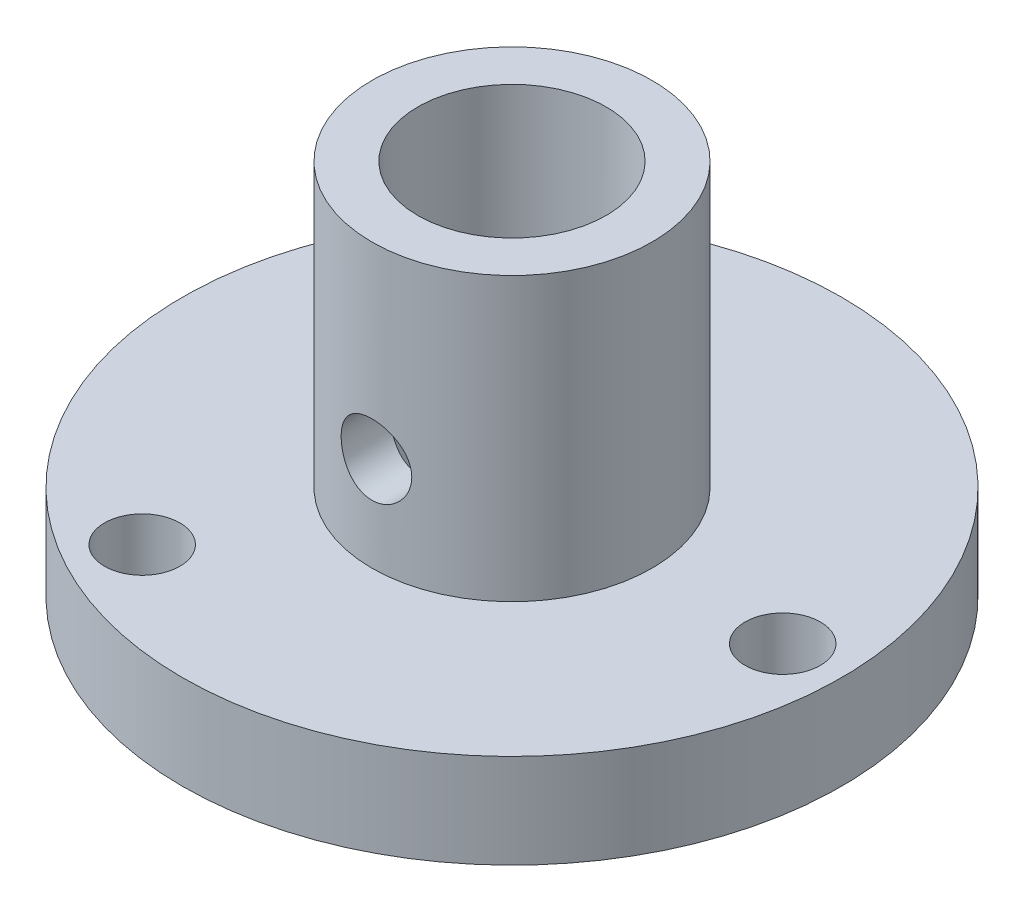
ISO-10303-21;
HEADER;
FILE_DESCRIPTION(('STEP AP214'),'2;1');
FILE_NAME('part.step','',(''),(''),'','','');
FILE_SCHEMA(('AUTOMOTIVE_DESIGN { 1 0 10303 214 1 1 1 1 }'));
ENDSEC;
DATA;
#1=APPLICATION_CONTEXT('core data for automotive mechanical design processes');
#2=APPLICATION_PROTOCOL_DEFINITION('international standard','automotive_design',2000,#1);
#3=PRODUCT_CONTEXT('',#1,'mechanical');
#4=PRODUCT('Part','Part','',(#3));
#5=PRODUCT_RELATED_PRODUCT_CATEGORY('part','',(#4));
#6=PRODUCT_DEFINITION_FORMATION('','',#4);
#7=PRODUCT_DEFINITION_CONTEXT('part definition',#1,'design');
#8=PRODUCT_DEFINITION('design','',#6,#7);
#9=PRODUCT_DEFINITION_SHAPE('','',#8);
#10=(LENGTH_UNIT() NAMED_UNIT(*) SI_UNIT(.MILLI.,.METRE.));
#11=(NAMED_UNIT(*) PLANE_ANGLE_UNIT() SI_UNIT($,.RADIAN.));
#12=(NAMED_UNIT(*) SI_UNIT($,.STERADIAN.) SOLID_ANGLE_UNIT());
#13=UNCERTAINTY_MEASURE_WITH_UNIT(LENGTH_MEASURE(1.E-05),#10,'distance_accuracy_value','');
#14=(GEOMETRIC_REPRESENTATION_CONTEXT(3) GLOBAL_UNCERTAINTY_ASSIGNED_CONTEXT((#13)) GLOBAL_UNIT_ASSIGNED_CONTEXT((#10,
#11,#12)) REPRESENTATION_CONTEXT('',''));
#15=CARTESIAN_POINT('',(0.,0.,0.));
#16=DIRECTION('',(0.,0.,1.));
#17=DIRECTION('',(1.,0.,0.));
#18=AXIS2_PLACEMENT_3D('',#15,#16,#17);
#19=CARTESIAN_POINT('',(0.,4.,0.));
#20=DIRECTION('',(0.,1.,0.));
#21=DIRECTION('',(0.,0.,1.));
#22=AXIS2_PLACEMENT_3D('',#19,#20,#21);
#23=CYLINDRICAL_SURFACE('',#22,5.95);
#24=CARTESIAN_POINT('',(0.,4.,0.));
#25=DIRECTION('',(0.,1.,0.));
#26=DIRECTION('',(0.,0.,1.));
#27=AXIS2_PLACEMENT_3D('',#24,#25,#26);
#28=CIRCLE('',#27,5.95);
#29=CARTESIAN_POINT('',(0.,4.,5.95));
#30=VERTEX_POINT('',#29);
#31=EDGE_CURVE('E115',#30,#30,#28,.F.);
#32=ORIENTED_EDGE('',*,*,#31,.F.);
#33=EDGE_LOOP('',(#32));
#34=FACE_BOUND('',#33,.T.);
#35=CARTESIAN_POINT('',(1.5,8.,-5.75782076831157));
#36=CARTESIAN_POINT('',(1.49999768871238,8.08280616495256,-5.75782233494609));
#37=CARTESIAN_POINT('',(1.49311978240876,8.16563776411494,-5.75962659429058));
#38=CARTESIAN_POINT('',(1.4658347600793,8.32892064843115,-5.7666298668346));
#39=CARTESIAN_POINT('',(1.44541990472251,8.40937054441823,-5.77183082196396));
#40=CARTESIAN_POINT('',(1.39176505830194,8.56550457418769,-5.7850018540609));
#41=CARTESIAN_POINT('',(1.35854180384155,8.64119477791168,-5.79296831602232));
#42=CARTESIAN_POINT('',(1.28026440234075,8.7859358420616,-5.81076822901485));
#43=CARTESIAN_POINT('',(1.23520970107067,8.85498639125396,-5.82060176750092));
#44=CARTESIAN_POINT('',(1.13347144633303,8.98603298568028,-5.8412741714264));
#45=CARTESIAN_POINT('',(1.07657158002437,9.04785856109596,-5.852129319229));
#46=CARTESIAN_POINT('',(0.953224007108164,9.16119777014973,-5.87348068088484));
#47=CARTESIAN_POINT('',(0.886775397339863,9.21271042724392,-5.88397686066896));
#48=CARTESIAN_POINT('',(0.745046980007374,9.30466064010565,-5.90360798591029));
#49=CARTESIAN_POINT('',(0.66965513530347,9.34493048314347,-5.91272147754516));
#50=CARTESIAN_POINT('',(0.512904027550645,9.41216106905905,-5.92837449499029));
#51=CARTESIAN_POINT('',(0.431545662394266,9.43912380980091,-5.93491440715546));
#52=CARTESIAN_POINT('',(0.266948406817762,9.47842809793499,-5.944568286417));
#53=CARTESIAN_POINT('',(0.183782699911668,9.49105919198469,-5.94775000410434));
#54=CARTESIAN_POINT('',(0.0164559237692994,9.50225076427592,-5.95056519154128));
#55=CARTESIAN_POINT('',(-0.0677049940231949,9.50081335652321,-5.95019919438891));
#56=CARTESIAN_POINT('',(-0.232624117632466,9.48411644185821,-5.94601052596882));
#57=CARTESIAN_POINT('',(-0.313416254189624,9.46916950854622,-5.94226602741368));
#58=CARTESIAN_POINT('',(-0.471306468441187,9.42638056850823,-5.93183226465853));
#59=CARTESIAN_POINT('',(-0.548404347404612,9.39853786891751,-5.92514284223439));
#60=CARTESIAN_POINT('',(-0.697537874248503,9.33049649456481,-5.90945172411485));
#61=CARTESIAN_POINT('',(-0.769520747132065,9.29018709230811,-5.90042943091868));
#62=CARTESIAN_POINT('',(-0.905809634403644,9.19844066483173,-5.88105044710892));
#63=CARTESIAN_POINT('',(-0.97011428998757,9.1470016745393,-5.87069352097939));
#64=CARTESIAN_POINT('',(-1.09108572538244,9.03278261151473,-5.84943692140127));
#65=CARTESIAN_POINT('',(-1.14749370224276,8.96972946000243,-5.83853015514328));
#66=CARTESIAN_POINT('',(-1.24899361099793,8.83494462622132,-5.81766341566799));
#67=CARTESIAN_POINT('',(-1.29408499549124,8.76321252438654,-5.80770348826526));
#68=CARTESIAN_POINT('',(-1.37184123304776,8.61259178695898,-5.78983234742103));
#69=CARTESIAN_POINT('',(-1.40444280016486,8.53366914899718,-5.78193163088578));
#70=CARTESIAN_POINT('',(-1.45583400038077,8.37121571984059,-5.76920756152378));
#71=CARTESIAN_POINT('',(-1.47462664585967,8.28768593795908,-5.76438353755494));
#72=CARTESIAN_POINT('',(-1.49743510422221,8.12079191991817,-5.75850017235609));
#73=CARTESIAN_POINT('',(-1.50183399029071,8.03748341446134,-5.75734326195708));
#74=CARTESIAN_POINT('',(-1.49677962599947,7.87132239473432,-5.75865936105513));
#75=CARTESIAN_POINT('',(-1.48732767478012,7.78846983842995,-5.76113203011554));
#76=CARTESIAN_POINT('',(-1.45517605430573,7.62700159452032,-5.76933509320014));
#77=CARTESIAN_POINT('',(-1.43270030307497,7.5483382530739,-5.77501038251313));
#78=CARTESIAN_POINT('',(-1.37538778324766,7.39589600588675,-5.78892671981359));
#79=CARTESIAN_POINT('',(-1.34054953143309,7.32211768749821,-5.79716807565594));
#80=CARTESIAN_POINT('',(-1.25870211192783,7.1799191873588,-5.81549274421369));
#81=CARTESIAN_POINT('',(-1.21146441620507,7.11163494417298,-5.82560946549267));
#82=CARTESIAN_POINT('',(-1.10644727101093,6.98382169560074,-5.84646341851986));
#83=CARTESIAN_POINT('',(-1.04866605859182,6.92429415740595,-5.8572007538335));
#84=CARTESIAN_POINT('',(-0.922442319036814,6.81412760660396,-5.87841742128496));
#85=CARTESIAN_POINT('',(-0.853765566559675,6.76375385725042,-5.88888319927538));
#86=CARTESIAN_POINT('',(-0.708705846793871,6.67525354560696,-5.90809451049535));
#87=CARTESIAN_POINT('',(-0.632323283420052,6.63712634182873,-5.91684013381929));
#88=CARTESIAN_POINT('',(-0.474550020021314,6.57453510167375,-5.93157038923435));
#89=CARTESIAN_POINT('',(-0.393200480838869,6.54997222088231,-5.93757493855685));
#90=CARTESIAN_POINT('',(-0.227356564063108,6.51491126434763,-5.94623375048927));
#91=CARTESIAN_POINT('',(-0.142862807686707,6.50441042530947,-5.94888867131996));
#92=CARTESIAN_POINT('',(0.0243807825053443,6.49792926093417,-5.95052170309761));
#93=CARTESIAN_POINT('',(0.107114717761271,6.50155776439544,-5.94959886746453));
#94=CARTESIAN_POINT('',(0.270753753592761,6.52233480837991,-5.94440026733245));
#95=CARTESIAN_POINT('',(0.35165891016747,6.53948293433942,-5.94012460564403));
#96=CARTESIAN_POINT('',(0.508926820324036,6.58660120238174,-5.92871663200681));
#97=CARTESIAN_POINT('',(0.58531232285441,6.61649954445729,-5.9216003306315));
#98=CARTESIAN_POINT('',(0.732025921925321,6.68820456280268,-5.90525977473839));
#99=CARTESIAN_POINT('',(0.802353242177573,6.73001276224005,-5.89603525062704));
#100=CARTESIAN_POINT('',(0.936804832205172,6.82553778839852,-5.87619190076882));
#101=CARTESIAN_POINT('',(1.00073686496424,6.8795192820921,-5.86554464290918));
#102=CARTESIAN_POINT('',(1.11876772120989,6.99734616967057,-5.84418209657475));
#103=CARTESIAN_POINT('',(1.17286403694311,7.06119407147921,-5.83346679146906));
#104=CARTESIAN_POINT('',(1.27070101081858,7.19840586566362,-5.81294857955095));
#105=CARTESIAN_POINT('',(1.31422468836178,7.27192790909911,-5.80316695036892));
#106=CARTESIAN_POINT('',(1.38822949660823,7.42548182868025,-5.78591158942593));
#107=CARTESIAN_POINT('',(1.41872000118598,7.50550897667455,-5.77843620002403));
#108=CARTESIAN_POINT('',(1.46132037834492,7.65448098960835,-5.76779217545035));
#109=CARTESIAN_POINT('',(1.47579332540437,7.72272085703775,-5.76408129197266));
#110=CARTESIAN_POINT('',(1.4951336837741,7.86063456266476,-5.7590950369232));
#111=CARTESIAN_POINT('',(1.50000194523711,7.93030827339497,-5.75781944979301));
#112=CARTESIAN_POINT('',(1.5,8.,-5.75782076831157));
#113=B_SPLINE_CURVE_WITH_KNOTS('',3,(#35,#36,#37,#38,#39,#40,#41,#42,#43,#44,#45,#46,#47,#48,
#49,#50,#51,#52,#53,#54,#55,#56,#57,#58,#59,#60,#61,#62,#63,#64,#65,#66,#67,#68,#69,#70,#71,#72,
#73,#74,#75,#76,#77,#78,#79,#80,#81,#82,#83,#84,#85,#86,#87,#88,#89,#90,#91,#92,#93,#94,#95,#96,
#97,#98,#99,#100,#101,#102,#103,#104,#105,#106,#107,#108,#109,#110,#111,#112),.UNSPECIFIED.,.T.,
.F.,(4,2,2,2,2,2,2,2,2,2,2,2,2,2,2,2,2,2,2,2,2,2,2,2,2,2,2,2,2,2,2,2,2,2,2,2,2,2,4),(0.,
0.24816252440501,0.496467050509526,0.744448213372956,0.992440994683889,1.24543802607959,
1.49845900277979,1.75507407358384,2.01165060571106,2.26294561163234,2.51420285724788,
2.75979145951352,3.00539325831315,3.25324234223002,3.50113522287185,3.75584806293773,
4.01057322149467,4.26657252022556,4.5225159567871,4.77158985386633,5.02064039053487,
5.26553095551585,5.51045091171653,5.76024757088363,6.01008603608886,6.26629324643614,
6.52248703416231,6.77678841394288,7.03103981429034,7.27830297848152,7.52555856092682,
7.77143979209798,8.01735248347586,8.2692402221725,8.52119209338009,8.77794514182155,
9.03451321327094,9.24339145154696,9.45225120026682),.UNSPECIFIED.);
#114=CARTESIAN_POINT('',(1.5,8.,-5.75782076831157));
#115=VERTEX_POINT('',#114);
#116=EDGE_CURVE('E118',#115,#115,#113,.T.);
#117=ORIENTED_EDGE('',*,*,#116,.T.);
#118=EDGE_LOOP('',(#117));
#119=FACE_BOUND('',#118,.T.);
#120=CARTESIAN_POINT('',(1.5,8.,5.75782076831157));
#121=CARTESIAN_POINT('',(1.49999768871238,7.91719383504744,5.75782233494609));
#122=CARTESIAN_POINT('',(1.49311978240876,7.83436223588506,5.75962659429058));
#123=CARTESIAN_POINT('',(1.4658347600793,7.67107935156885,5.7666298668346));
#124=CARTESIAN_POINT('',(1.44541990472251,7.59062945558177,5.77183082196396));
#125=CARTESIAN_POINT('',(1.39176505830194,7.43449542581231,5.7850018540609));
#126=CARTESIAN_POINT('',(1.35854180384155,7.35880522208832,5.79296831602232));
#127=CARTESIAN_POINT('',(1.28026440234075,7.2140641579384,5.81076822901485));
#128=CARTESIAN_POINT('',(1.23520970107067,7.14501360874604,5.82060176750092));
#129=CARTESIAN_POINT('',(1.13347144633303,7.01396701431972,5.8412741714264));
#130=CARTESIAN_POINT('',(1.07657158002437,6.95214143890404,5.852129319229));
#131=CARTESIAN_POINT('',(0.953224007108162,6.83880222985027,5.87348068088484));
#132=CARTESIAN_POINT('',(0.886775397339862,6.78728957275608,5.88397686066896));
#133=CARTESIAN_POINT('',(0.745046980007372,6.69533935989435,5.90360798591029));
#134=CARTESIAN_POINT('',(0.669655135303469,6.65506951685653,5.91272147754516));
#135=CARTESIAN_POINT('',(0.512904027550644,6.58783893094095,5.92837449499029));
#136=CARTESIAN_POINT('',(0.431545662394265,6.56087619019909,5.93491440715546));
#137=CARTESIAN_POINT('',(0.266948406817762,6.52157190206501,5.944568286417));
#138=CARTESIAN_POINT('',(0.183782699911668,6.50894080801531,5.94775000410434));
#139=CARTESIAN_POINT('',(0.0164559237692992,6.49774923572408,5.95056519154128));
#140=CARTESIAN_POINT('',(-0.0677049940231953,6.49918664347679,5.95019919438891));
#141=CARTESIAN_POINT('',(-0.232624117632467,6.5158835581418,5.94601052596882));
#142=CARTESIAN_POINT('',(-0.313416254189624,6.53083049145378,5.94226602741368));
#143=CARTESIAN_POINT('',(-0.471306468441187,6.57361943149176,5.93183226465853));
#144=CARTESIAN_POINT('',(-0.548404347404613,6.60146213108249,5.92514284223439));
#145=CARTESIAN_POINT('',(-0.697537874248504,6.66950350543519,5.90945172411485));
#146=CARTESIAN_POINT('',(-0.769520747132066,6.70981290769188,5.90042943091868));
#147=CARTESIAN_POINT('',(-0.905809634403646,6.80155933516827,5.88105044710892));
#148=CARTESIAN_POINT('',(-0.97011428998757,6.8529983254607,5.87069352097939));
#149=CARTESIAN_POINT('',(-1.09108572538244,6.96721738848527,5.84943692140127));
#150=CARTESIAN_POINT('',(-1.14749370224276,7.03027053999757,5.83853015514328));
#151=CARTESIAN_POINT('',(-1.24899361099793,7.16505537377868,5.81766341566799));
#152=CARTESIAN_POINT('',(-1.29408499549124,7.23678747561346,5.80770348826526));
#153=CARTESIAN_POINT('',(-1.37184123304776,7.38740821304102,5.78983234742103));
#154=CARTESIAN_POINT('',(-1.40444280016486,7.46633085100282,5.78193163088578));
#155=CARTESIAN_POINT('',(-1.45583400038077,7.62878428015941,5.76920756152378));
#156=CARTESIAN_POINT('',(-1.47462664585967,7.71231406204092,5.76438353755494));
#157=CARTESIAN_POINT('',(-1.49743510422221,7.87920808008183,5.75850017235609));
#158=CARTESIAN_POINT('',(-1.50183399029071,7.96251658553866,5.75734326195708));
#159=CARTESIAN_POINT('',(-1.49677962599947,8.12867760526568,5.75865936105513));
#160=CARTESIAN_POINT('',(-1.48732767478012,8.21153016157005,5.76113203011554));
#161=CARTESIAN_POINT('',(-1.45517605430573,8.37299840547968,5.76933509320014));
#162=CARTESIAN_POINT('',(-1.43270030307497,8.4516617469261,5.77501038251313));
#163=CARTESIAN_POINT('',(-1.37538778324766,8.60410399411325,5.78892671981359));
#164=CARTESIAN_POINT('',(-1.34054953143309,8.6778823125018,5.79716807565594));
#165=CARTESIAN_POINT('',(-1.25870211192783,8.8200808126412,5.81549274421369));
#166=CARTESIAN_POINT('',(-1.21146441620507,8.88836505582703,5.82560946549267));
#167=CARTESIAN_POINT('',(-1.10644727101093,9.01617830439927,5.84646341851986));
#168=CARTESIAN_POINT('',(-1.04866605859182,9.07570584259405,5.8572007538335));
#169=CARTESIAN_POINT('',(-0.922442319036812,9.18587239339605,5.87841742128496));
#170=CARTESIAN_POINT('',(-0.853765566559673,9.23624614274958,5.88888319927538));
#171=CARTESIAN_POINT('',(-0.70870584679387,9.32474645439304,5.90809451049535));
#172=CARTESIAN_POINT('',(-0.63232328342005,9.36287365817127,5.91684013381929));
#173=CARTESIAN_POINT('',(-0.474550020021313,9.42546489832625,5.93157038923435));
#174=CARTESIAN_POINT('',(-0.393200480838867,9.45002777911768,5.93757493855685));
#175=CARTESIAN_POINT('',(-0.227356564063106,9.48508873565237,5.94623375048927));
#176=CARTESIAN_POINT('',(-0.142862807686706,9.49558957469053,5.94888867131997));
#177=CARTESIAN_POINT('',(0.0243807825053454,9.50207073906583,5.95052170309761));
#178=CARTESIAN_POINT('',(0.107114717761272,9.49844223560456,5.94959886746453));
#179=CARTESIAN_POINT('',(0.270753753592761,9.47766519162009,5.94440026733245));
#180=CARTESIAN_POINT('',(0.351658910167471,9.46051706566058,5.94012460564403));
#181=CARTESIAN_POINT('',(0.508926820324036,9.41339879761826,5.92871663200681));
#182=CARTESIAN_POINT('',(0.585312322854411,9.38350045554271,5.9216003306315));
#183=CARTESIAN_POINT('',(0.732025921925321,9.31179543719732,5.90525977473839));
#184=CARTESIAN_POINT('',(0.802353242177573,9.26998723775995,5.89603525062704));
#185=CARTESIAN_POINT('',(0.936804832205173,9.17446221160148,5.87619190076882));
#186=CARTESIAN_POINT('',(1.00073686496424,9.1204807179079,5.86554464290918));
#187=CARTESIAN_POINT('',(1.11876772120989,9.00265383032943,5.84418209657475));
#188=CARTESIAN_POINT('',(1.17286403694311,8.93880592852079,5.83346679146906));
#189=CARTESIAN_POINT('',(1.27070101081858,8.80159413433638,5.81294857955095));
#190=CARTESIAN_POINT('',(1.31422468836178,8.72807209090089,5.80316695036892));
#191=CARTESIAN_POINT('',(1.38822949660823,8.57451817131975,5.78591158942593));
#192=CARTESIAN_POINT('',(1.41872000118598,8.49449102332545,5.77843620002403));
#193=CARTESIAN_POINT('',(1.46132037834492,8.34551901039165,5.76779217545035));
#194=CARTESIAN_POINT('',(1.47579332540437,8.27727914296225,5.76408129197266));
#195=CARTESIAN_POINT('',(1.4951336837741,8.13936543733523,5.7590950369232));
#196=CARTESIAN_POINT('',(1.50000194523711,8.06969172660503,5.75781944979301));
#197=CARTESIAN_POINT('',(1.5,8.,5.75782076831157));
#198=B_SPLINE_CURVE_WITH_KNOTS('',3,(#120,#121,#122,#123,#124,#125,#126,#127,#128,#129,#130,
#131,#132,#133,#134,#135,#136,#137,#138,#139,#140,#141,#142,#143,#144,#145,#146,#147,#148,#149,
#150,#151,#152,#153,#154,#155,#156,#157,#158,#159,#160,#161,#162,#163,#164,#165,#166,#167,#168,
#169,#170,#171,#172,#173,#174,#175,#176,#177,#178,#179,#180,#181,#182,#183,#184,#185,#186,#187,
#188,#189,#190,#191,#192,#193,#194,#195,#196,#197),.UNSPECIFIED.,.T.,.F.,(4,2,2,2,2,2,2,2,2,2,2,
2,2,2,2,2,2,2,2,2,2,2,2,2,2,2,2,2,2,2,2,2,2,2,2,2,2,2,4),(0.,0.24816252440501,0.496467050509526,
0.744448213372958,0.992440994683891,1.24543802607959,1.49845900277979,1.75507407358384,
2.01165060571106,2.26294561163234,2.51420285724788,2.75979145951352,3.00539325831315,
3.25324234223003,3.50113522287185,3.75584806293773,4.01057322149467,4.26657252022556,
4.5225159567871,4.77158985386633,5.02064039053487,5.26553095551585,5.51045091171654,
5.76024757088363,6.01008603608886,6.26629324643614,6.52248703416231,6.77678841394288,
7.03103981429034,7.27830297848152,7.52555856092682,7.77143979209798,8.01735248347586,
8.2692402221725,8.52119209338009,8.77794514182155,9.03451321327094,9.24339145154696,
9.45225120026682),.UNSPECIFIED.);
#199=CARTESIAN_POINT('',(1.5,8.,5.75782076831157));
#200=VERTEX_POINT('',#199);
#201=EDGE_CURVE('E124',#200,#200,#198,.T.);
#202=ORIENTED_EDGE('',*,*,#201,.T.);
#203=EDGE_LOOP('',(#202));
#204=FACE_BOUND('',#203,.T.);
#205=CARTESIAN_POINT('',(0.,16.,0.));
#206=DIRECTION('',(0.,1.,0.));
#207=DIRECTION('',(0.,0.,1.));
#208=AXIS2_PLACEMENT_3D('',#205,#206,#207);
#209=CIRCLE('',#208,5.95);
#210=CARTESIAN_POINT('',(0.,16.,5.95));
#211=VERTEX_POINT('',#210);
#212=EDGE_CURVE('E19',#211,#211,#209,.T.);
#213=ORIENTED_EDGE('',*,*,#212,.F.);
#214=EDGE_LOOP('',(#213));
#215=FACE_BOUND('',#214,.T.);
#216=ADVANCED_FACE('F15',(#34,#119,#204,#215),#23,.T.);
#217=CARTESIAN_POINT('',(0.,16.,0.));
#218=DIRECTION('',(0.,1.,0.));
#219=DIRECTION('',(0.,0.,1.));
#220=AXIS2_PLACEMENT_3D('',#217,#218,#219);
#221=PLANE('',#220);
#222=CARTESIAN_POINT('',(0.,16.,0.));
#223=DIRECTION('',(0.,1.,0.));
#224=DIRECTION('',(0.,0.,1.));
#225=AXIS2_PLACEMENT_3D('',#222,#223,#224);
#226=CIRCLE('',#225,4.);
#227=CARTESIAN_POINT('',(0.,16.,4.));
#228=VERTEX_POINT('',#227);
#229=EDGE_CURVE('E114',#228,#228,#226,.F.);
#230=ORIENTED_EDGE('',*,*,#229,.T.);
#231=EDGE_LOOP('',(#230));
#232=FACE_BOUND('',#231,.T.);
#233=ORIENTED_EDGE('',*,*,#212,.T.);
#234=EDGE_LOOP('',(#233));
#235=FACE_BOUND('',#234,.T.);
#236=ADVANCED_FACE('F130',(#232,#235),#221,.T.);
#237=CARTESIAN_POINT('',(0.,8.,0.));
#238=DIRECTION('',(0.,0.,1.));
#239=DIRECTION('',(1.,0.,0.));
#240=AXIS2_PLACEMENT_3D('',#237,#238,#239);
#241=CYLINDRICAL_SURFACE('',#240,1.5);
#242=ORIENTED_EDGE('',*,*,#201,.F.);
#243=EDGE_LOOP('',(#242));
#244=FACE_BOUND('',#243,.T.);
#245=CARTESIAN_POINT('',(1.5,8.,3.70809924354783));
#246=CARTESIAN_POINT('',(1.50000304106109,7.91899251627921,3.70809640633806));
#247=CARTESIAN_POINT('',(1.49341597549487,7.83800507749637,3.71078260240986));
#248=CARTESIAN_POINT('',(1.46736187895468,7.6784719170868,3.72116159304967));
#249=CARTESIAN_POINT('',(1.44789523373263,7.59992612240499,3.72885423767112));
#250=CARTESIAN_POINT('',(1.39689657610574,7.44762462838647,3.748254802809));
#251=CARTESIAN_POINT('',(1.36539347266348,7.37385794334892,3.7599530956926));
#252=CARTESIAN_POINT('',(1.29131856742698,7.23262810318116,3.78603134206598));
#253=CARTESIAN_POINT('',(1.24874344095039,7.16516684971748,3.80041210067323));
#254=CARTESIAN_POINT('',(1.15146661374162,7.03510968837718,3.83103574665713));
#255=CARTESIAN_POINT('',(1.09630381213306,6.97287147037061,3.84733341923603));
#256=CARTESIAN_POINT('',(0.976395839778926,6.85827718532851,3.87949750628547));
#257=CARTESIAN_POINT('',(0.911648630256679,6.80592322625815,3.89536382814785));
#258=CARTESIAN_POINT('',(0.771694655177599,6.71086048770439,3.92552873936553));
#259=CARTESIAN_POINT('',(0.696206947538027,6.66854052528414,3.93975561223505));
#260=CARTESIAN_POINT('',(0.538555771965247,6.59734882747509,3.96438007973848));
#261=CARTESIAN_POINT('',(0.456394630933536,6.56847242800803,3.97477900217006));
#262=CARTESIAN_POINT('',(0.291489341676832,6.52624210422538,3.9901869710344));
#263=CARTESIAN_POINT('',(0.208923197281596,6.51227237255954,3.99540915214774));
#264=CARTESIAN_POINT('',(0.0424643637947857,6.49827879905501,4.0006401410794));
#265=CARTESIAN_POINT('',(-0.0414278850628334,6.49825042238129,4.00065064414902));
#266=CARTESIAN_POINT('',(-0.203743543064476,6.51178176146517,3.99559265903894));
#267=CARTESIAN_POINT('',(-0.2822321782669,6.52466929794882,3.99077541996683));
#268=CARTESIAN_POINT('',(-0.435839217984391,6.56253591522555,3.97693274932263));
#269=CARTESIAN_POINT('',(-0.510957383430299,6.58751585226204,3.96790701975577));
#270=CARTESIAN_POINT('',(-0.656989017303104,6.64917045167585,3.9463776916753));
#271=CARTESIAN_POINT('',(-0.727825392287309,6.68601000526841,3.93382539470077));
#272=CARTESIAN_POINT('',(-0.86248660795756,6.77019209692939,3.90651310225279));
#273=CARTESIAN_POINT('',(-0.926309176932323,6.8175380230176,3.8917523951284));
#274=CARTESIAN_POINT('',(-1.04909048680094,6.92462728628319,3.86052529655816));
#275=CARTESIAN_POINT('',(-1.10754614526348,6.98493391565043,3.84400963763883));
#276=CARTESIAN_POINT('',(-1.21370395569342,7.11459299332156,3.81182460645722));
#277=CARTESIAN_POINT('',(-1.261403406929,7.18394770658664,3.79615544748847));
#278=CARTESIAN_POINT('',(-1.34565611808151,7.33171946746282,3.76712703500335));
#279=CARTESIAN_POINT('',(-1.38193847851831,7.41030349368607,3.75382677150277));
#280=CARTESIAN_POINT('',(-1.44056464441501,7.57309622516757,3.73172438629002));
#281=CARTESIAN_POINT('',(-1.46291620605595,7.65730177159369,3.72291976205783));
#282=CARTESIAN_POINT('',(-1.49190191709668,7.82397596231595,3.71139597222848));
#283=CARTESIAN_POINT('',(-1.49933521158966,7.90628410553614,3.70836785241537));
#284=CARTESIAN_POINT('',(-1.50057885636272,8.07100935674174,3.70786539525016));
#285=CARTESIAN_POINT('',(-1.49439261093762,8.15342643235247,3.71038967003987));
#286=CARTESIAN_POINT('',(-1.46929733520157,8.31192992228768,3.72039381629735));
#287=CARTESIAN_POINT('',(-1.45100618334225,8.38813113576466,3.72763276216449));
#288=CARTESIAN_POINT('',(-1.40299774640637,8.53634794472019,3.74596487046362));
#289=CARTESIAN_POINT('',(-1.37327812034623,8.60836267916813,3.75705882250173));
#290=CARTESIAN_POINT('',(-1.30200292275278,8.74916443807621,3.7823624311608));
#291=CARTESIAN_POINT('',(-1.26004545177047,8.81772929213734,3.79667328892065));
#292=CARTESIAN_POINT('',(-1.16591317862479,8.94712898172604,3.82662814294291));
#293=CARTESIAN_POINT('',(-1.11373463696435,9.00796097462463,3.84227262594077));
#294=CARTESIAN_POINT('',(-0.996727340900938,9.1241683731951,3.87433046553184));
#295=CARTESIAN_POINT('',(-0.931306341491062,9.17895340876875,3.89072969357028));
#296=CARTESIAN_POINT('',(-0.79179747175315,9.27683836758944,3.92149874963302));
#297=CARTESIAN_POINT('',(-0.717709573322673,9.31993825294584,3.93586857107664));
#298=CARTESIAN_POINT('',(-0.563016329468476,9.39294605619961,3.96094985704552));
#299=CARTESIAN_POINT('',(-0.482434433064626,9.4228991237926,3.9716738133801));
#300=CARTESIAN_POINT('',(-0.316881887523254,9.46865641384992,3.98829436712571));
#301=CARTESIAN_POINT('',(-0.231913320723592,9.4844672854224,3.99419323299412));
#302=CARTESIAN_POINT('',(-0.0653355852738152,9.50077440275483,4.00028407317073));
#303=CARTESIAN_POINT('',(0.0161807680608456,9.50210948305899,4.00078860953764));
#304=CARTESIAN_POINT('',(0.178226786412424,9.49158484055461,3.99684889809223));
#305=CARTESIAN_POINT('',(0.258756569245257,9.47972670911414,3.9924052471313));
#306=CARTESIAN_POINT('',(0.414548248377126,9.44374114850638,3.97921089603771));
#307=CARTESIAN_POINT('',(0.489890731068835,9.41992009412164,3.97056791378017));
#308=CARTESIAN_POINT('',(0.63551547300639,9.36098998661564,3.9498778362099));
#309=CARTESIAN_POINT('',(0.705796771275543,9.32587879669525,3.93783009655664));
#310=CARTESIAN_POINT('',(0.842540176994413,9.24368605649519,3.91090618300074));
#311=CARTESIAN_POINT('',(0.90871754884685,9.19616335948585,3.89593240108828));
#312=CARTESIAN_POINT('',(1.03241734752336,9.09119216981239,3.86499507694844));
#313=CARTESIAN_POINT('',(1.0899366712559,9.03374013419212,3.84903118274027));
#314=CARTESIAN_POINT('',(1.19781214236196,8.90693586835494,3.81688129739175));
#315=CARTESIAN_POINT('',(1.24762999816025,8.83711559784569,3.8007280534916));
#316=CARTESIAN_POINT('',(1.33484709556843,8.68958413042668,3.77098325003638));
#317=CARTESIAN_POINT('',(1.37224504878157,8.61187211594652,3.75739195631216));
#318=CARTESIAN_POINT('',(1.4346588697426,8.4470443190246,3.73402269853266));
#319=CARTESIAN_POINT('',(1.45906002899523,8.35966563348822,3.7244380329086));
#320=CARTESIAN_POINT('',(1.49172356722079,8.18151472804422,3.71147994336315));
#321=CARTESIAN_POINT('',(1.49999659339571,8.09074478729001,3.70810242179736));
#322=CARTESIAN_POINT('',(1.5,8.,3.70809924354783));
#323=B_SPLINE_CURVE_WITH_KNOTS('',3,(#245,#246,#247,#248,#249,#250,#251,#252,#253,#254,#255,
#256,#257,#258,#259,#260,#261,#262,#263,#264,#265,#266,#267,#268,#269,#270,#271,#272,#273,#274,
#275,#276,#277,#278,#279,#280,#281,#282,#283,#284,#285,#286,#287,#288,#289,#290,#291,#292,#293,
#294,#295,#296,#297,#298,#299,#300,#301,#302,#303,#304,#305,#306,#307,#308,#309,#310,#311,#312,
#313,#314,#315,#316,#317,#318,#319,#320,#321,#322),.UNSPECIFIED.,.T.,.F.,(4,2,2,2,2,2,2,2,2,2,2,
2,2,2,2,2,2,2,2,2,2,2,2,2,2,2,2,2,2,2,2,2,2,2,2,2,2,2,4),(0.,0.242684541416169,
0.485361814598854,0.72745985675703,0.969630679682932,1.22274652401128,1.47591628822983,
1.73770072136421,1.9993942638133,2.24980018489679,2.50012465404857,2.73806472803194,
2.97602165263335,3.21744131210668,3.45893893628976,3.71456675065874,3.97025867827335,
4.23162592252966,4.49284751635474,4.73965657740485,4.98640395388884,5.22143845928199,
5.45652113429526,5.70041561005821,5.94439948466355,6.20385016993624,6.46330169650178,
6.72185508890168,6.98028685560127,7.22365720549936,7.46699820319479,7.7044027400389,
7.94185223512831,8.18928323676987,8.43680270894964,8.69738599542079,8.95799630544242,
9.23003178870926,9.50188762323053),.UNSPECIFIED.);
#324=CARTESIAN_POINT('',(1.5,8.,3.70809924354783));
#325=VERTEX_POINT('',#324);
#326=EDGE_CURVE('E55',#325,#325,#323,.T.);
#327=ORIENTED_EDGE('',*,*,#326,.T.);
#328=EDGE_LOOP('',(#327));
#329=FACE_BOUND('',#328,.T.);
#330=ADVANCED_FACE('F82',(#244,#329),#241,.F.);
#331=CARTESIAN_POINT('',(0.,8.,0.));
#332=DIRECTION('',(0.,0.,1.));
#333=DIRECTION('',(1.,0.,0.));
#334=AXIS2_PLACEMENT_3D('',#331,#332,#333);
#335=CYLINDRICAL_SURFACE('',#334,1.5);
#336=CARTESIAN_POINT('',(1.5,8.,-3.70809924354783));
#337=CARTESIAN_POINT('',(1.50000304106109,8.08100748372079,-3.70809640633806));
#338=CARTESIAN_POINT('',(1.49341597549487,8.16199492250363,-3.71078260240986));
#339=CARTESIAN_POINT('',(1.46736187895468,8.3215280829132,-3.72116159304967));
#340=CARTESIAN_POINT('',(1.44789523373263,8.40007387759501,-3.72885423767112));
#341=CARTESIAN_POINT('',(1.39689657610574,8.55237537161353,-3.748254802809));
#342=CARTESIAN_POINT('',(1.36539347266348,8.62614205665108,-3.7599530956926));
#343=CARTESIAN_POINT('',(1.29131856742698,8.76737189681884,-3.78603134206598));
#344=CARTESIAN_POINT('',(1.24874344095039,8.83483315028252,-3.80041210067323));
#345=CARTESIAN_POINT('',(1.15146661374162,8.96489031162282,-3.83103574665713));
#346=CARTESIAN_POINT('',(1.09630381213306,9.02712852962939,-3.84733341923603));
#347=CARTESIAN_POINT('',(0.976395839778926,9.14172281467149,-3.87949750628547));
#348=CARTESIAN_POINT('',(0.911648630256679,9.19407677374185,-3.89536382814785));
#349=CARTESIAN_POINT('',(0.7716946551776,9.28913951229561,-3.92552873936553));
#350=CARTESIAN_POINT('',(0.696206947538027,9.33145947471586,-3.93975561223505));
#351=CARTESIAN_POINT('',(0.538555771965247,9.40265117252491,-3.96438007973848));
#352=CARTESIAN_POINT('',(0.456394630933536,9.43152757199197,-3.97477900217006));
#353=CARTESIAN_POINT('',(0.291489341676832,9.47375789577462,-3.9901869710344));
#354=CARTESIAN_POINT('',(0.208923197281597,9.48772762744046,-3.99540915214774));
#355=CARTESIAN_POINT('',(0.0424643637947865,9.50172120094499,-4.0006401410794));
#356=CARTESIAN_POINT('',(-0.0414278850628324,9.50174957761871,-4.00065064414902));
#357=CARTESIAN_POINT('',(-0.203743543064475,9.48821823853483,-3.99559265903894));
#358=CARTESIAN_POINT('',(-0.2822321782669,9.47533070205118,-3.99077541996683));
#359=CARTESIAN_POINT('',(-0.435839217984391,9.43746408477445,-3.97693274932263));
#360=CARTESIAN_POINT('',(-0.510957383430298,9.41248414773796,-3.96790701975578));
#361=CARTESIAN_POINT('',(-0.656989017303103,9.35082954832415,-3.94637769167531));
#362=CARTESIAN_POINT('',(-0.727825392287308,9.31398999473159,-3.93382539470077));
#363=CARTESIAN_POINT('',(-0.862486607957558,9.22980790307061,-3.90651310225279));
#364=CARTESIAN_POINT('',(-0.926309176932322,9.1824619769824,-3.8917523951284));
#365=CARTESIAN_POINT('',(-1.04909048680094,9.07537271371682,-3.86052529655816));
#366=CARTESIAN_POINT('',(-1.10754614526348,9.01506608434958,-3.84400963763883));
#367=CARTESIAN_POINT('',(-1.21370395569342,8.88540700667844,-3.81182460645722));
#368=CARTESIAN_POINT('',(-1.261403406929,8.81605229341336,-3.79615544748847));
#369=CARTESIAN_POINT('',(-1.34565611808151,8.66828053253718,-3.76712703500335));
#370=CARTESIAN_POINT('',(-1.38193847851831,8.58969650631393,-3.75382677150277));
#371=CARTESIAN_POINT('',(-1.44056464441501,8.42690377483243,-3.73172438629002));
#372=CARTESIAN_POINT('',(-1.46291620605595,8.34269822840631,-3.72291976205783));
#373=CARTESIAN_POINT('',(-1.49190191709668,8.17602403768405,-3.71139597222848));
#374=CARTESIAN_POINT('',(-1.49933521158966,8.09371589446386,-3.70836785241537));
#375=CARTESIAN_POINT('',(-1.50057885636272,7.92899064325826,-3.70786539525016));
#376=CARTESIAN_POINT('',(-1.49439261093762,7.84657356764753,-3.71038967003987));
#377=CARTESIAN_POINT('',(-1.46929733520157,7.68807007771232,-3.72039381629735));
#378=CARTESIAN_POINT('',(-1.45100618334224,7.61186886423534,-3.72763276216449));
#379=CARTESIAN_POINT('',(-1.40299774640637,7.46365205527981,-3.74596487046362));
#380=CARTESIAN_POINT('',(-1.37327812034623,7.39163732083187,-3.75705882250173));
#381=CARTESIAN_POINT('',(-1.30200292275278,7.2508355619238,-3.7823624311608));
#382=CARTESIAN_POINT('',(-1.26004545177047,7.18227070786266,-3.79667328892065));
#383=CARTESIAN_POINT('',(-1.16591317862479,7.05287101827396,-3.82662814294291));
#384=CARTESIAN_POINT('',(-1.11373463696435,6.99203902537537,-3.84227262594077));
#385=CARTESIAN_POINT('',(-0.996727340900939,6.8758316268049,-3.87433046553184));
#386=CARTESIAN_POINT('',(-0.931306341491063,6.82104659123125,-3.89072969357028));
#387=CARTESIAN_POINT('',(-0.791797471753152,6.72316163241056,-3.92149874963302));
#388=CARTESIAN_POINT('',(-0.717709573322675,6.68006174705416,-3.93586857107664));
#389=CARTESIAN_POINT('',(-0.563016329468478,6.60705394380039,-3.96094985704552));
#390=CARTESIAN_POINT('',(-0.482434433064628,6.5771008762074,-3.9716738133801));
#391=CARTESIAN_POINT('',(-0.316881887523256,6.53134358615008,-3.98829436712571));
#392=CARTESIAN_POINT('',(-0.231913320723594,6.5155327145776,-3.99419323299412));
#393=CARTESIAN_POINT('',(-0.0653355852738174,6.49922559724518,-4.00028407317073));
#394=CARTESIAN_POINT('',(0.0161807680608432,6.49789051694101,-4.00078860953764));
#395=CARTESIAN_POINT('',(0.178226786412422,6.50841515944539,-3.99684889809224));
#396=CARTESIAN_POINT('',(0.258756569245255,6.52027329088586,-3.9924052471313));
#397=CARTESIAN_POINT('',(0.414548248377124,6.55625885149362,-3.97921089603771));
#398=CARTESIAN_POINT('',(0.489890731068833,6.58007990587836,-3.97056791378017));
#399=CARTESIAN_POINT('',(0.635515473006388,6.63901001338436,-3.9498778362099));
#400=CARTESIAN_POINT('',(0.705796771275541,6.67412120330475,-3.93783009655664));
#401=CARTESIAN_POINT('',(0.842540176994411,6.75631394350481,-3.91090618300074));
#402=CARTESIAN_POINT('',(0.908717548846848,6.80383664051415,-3.89593240108828));
#403=CARTESIAN_POINT('',(1.03241734752336,6.9088078301876,-3.86499507694844));
#404=CARTESIAN_POINT('',(1.0899366712559,6.96625986580787,-3.84903118274027));
#405=CARTESIAN_POINT('',(1.19781214236196,7.09306413164506,-3.81688129739175));
#406=CARTESIAN_POINT('',(1.24762999816025,7.16288440215431,-3.8007280534916));
#407=CARTESIAN_POINT('',(1.33484709556843,7.31041586957332,-3.77098325003638));
#408=CARTESIAN_POINT('',(1.37224504878157,7.38812788405348,-3.75739195631216));
#409=CARTESIAN_POINT('',(1.4346588697426,7.5529556809754,-3.73402269853266));
#410=CARTESIAN_POINT('',(1.45906002899523,7.64033436651178,-3.7244380329086));
#411=CARTESIAN_POINT('',(1.49172356722079,7.81848527195579,-3.71147994336315));
#412=CARTESIAN_POINT('',(1.49999659339571,7.90925521270999,-3.70810242179736));
#413=CARTESIAN_POINT('',(1.5,8.,-3.70809924354783));
#414=B_SPLINE_CURVE_WITH_KNOTS('',3,(#336,#337,#338,#339,#340,#341,#342,#343,#344,#345,#346,
#347,#348,#349,#350,#351,#352,#353,#354,#355,#356,#357,#358,#359,#360,#361,#362,#363,#364,#365,
#366,#367,#368,#369,#370,#371,#372,#373,#374,#375,#376,#377,#378,#379,#380,#381,#382,#383,#384,
#385,#386,#387,#388,#389,#390,#391,#392,#393,#394,#395,#396,#397,#398,#399,#400,#401,#402,#403,
#404,#405,#406,#407,#408,#409,#410,#411,#412,#413),.UNSPECIFIED.,.T.,.F.,(4,2,2,2,2,2,2,2,2,2,2,
2,2,2,2,2,2,2,2,2,2,2,2,2,2,2,2,2,2,2,2,2,2,2,2,2,2,2,4),(0.,0.242684541416169,
0.485361814598854,0.727459856757029,0.969630679682932,1.22274652401128,1.47591628822983,
1.73770072136421,1.9993942638133,2.24980018489679,2.50012465404857,2.73806472803194,
2.97602165263335,3.21744131210668,3.45893893628976,3.71456675065874,3.97025867827334,
4.23162592252966,4.49284751635474,4.73965657740485,4.98640395388884,5.22143845928199,
5.45652113429526,5.70041561005821,5.94439948466355,6.20385016993624,6.46330169650178,
6.72185508890168,6.98028685560126,7.22365720549935,7.46699820319479,7.7044027400389,
7.94185223512831,8.18928323676987,8.43680270894964,8.69738599542079,8.95799630544242,
9.23003178870926,9.50188762323053),.UNSPECIFIED.);
#415=CARTESIAN_POINT('',(1.5,8.,-3.70809924354783));
#416=VERTEX_POINT('',#415);
#417=EDGE_CURVE('E48',#416,#416,#414,.T.);
#418=ORIENTED_EDGE('',*,*,#417,.T.);
#419=EDGE_LOOP('',(#418));
#420=FACE_BOUND('',#419,.T.);
#421=ORIENTED_EDGE('',*,*,#116,.F.);
#422=EDGE_LOOP('',(#421));
#423=FACE_BOUND('',#422,.T.);
#424=ADVANCED_FACE('F60',(#420,#423),#335,.F.);
#425=CARTESIAN_POINT('',(0.,4.,0.));
#426=DIRECTION('',(0.,1.,0.));
#427=DIRECTION('',(0.,0.,1.));
#428=AXIS2_PLACEMENT_3D('',#425,#426,#427);
#429=PLANE('',#428);
#430=ORIENTED_EDGE('',*,*,#31,.T.);
#431=EDGE_LOOP('',(#430));
#432=FACE_BOUND('',#431,.T.);
#433=CARTESIAN_POINT('',(11.5,4.,0.));
#434=DIRECTION('',(0.,-1.,0.));
#435=DIRECTION('',(0.,0.,-1.));
#436=AXIS2_PLACEMENT_3D('',#433,#434,#435);
#437=CIRCLE('',#436,1.6);
#438=CARTESIAN_POINT('',(11.5,4.,-1.6));
#439=VERTEX_POINT('',#438);
#440=EDGE_CURVE('E39',#439,#439,#437,.T.);
#441=ORIENTED_EDGE('',*,*,#440,.T.);
#442=EDGE_LOOP('',(#441));
#443=FACE_BOUND('',#442,.T.);
#444=CARTESIAN_POINT('',(-5.75,4.,-9.95929214352105));
#445=DIRECTION('',(0.,-1.,0.));
#446=DIRECTION('',(0.,0.,-1.));
#447=AXIS2_PLACEMENT_3D('',#444,#445,#446);
#448=CIRCLE('',#447,1.6);
#449=CARTESIAN_POINT('',(-5.75,4.,-11.5592921435211));
#450=VERTEX_POINT('',#449);
#451=EDGE_CURVE('E42',#450,#450,#448,.T.);
#452=ORIENTED_EDGE('',*,*,#451,.T.);
#453=EDGE_LOOP('',(#452));
#454=FACE_BOUND('',#453,.T.);
#455=CARTESIAN_POINT('',(-5.75000000000001,4.,9.95929214352105));
#456=DIRECTION('',(0.,-1.,0.));
#457=DIRECTION('',(0.,0.,-1.));
#458=AXIS2_PLACEMENT_3D('',#455,#456,#457);
#459=CIRCLE('',#458,1.6);
#460=CARTESIAN_POINT('',(-5.75000000000001,4.,8.35929214352105));
#461=VERTEX_POINT('',#460);
#462=EDGE_CURVE('E45',#461,#461,#459,.T.);
#463=ORIENTED_EDGE('',*,*,#462,.T.);
#464=EDGE_LOOP('',(#463));
#465=FACE_BOUND('',#464,.T.);
#466=CARTESIAN_POINT('',(0.,4.,0.));
#467=DIRECTION('',(0.,1.,0.));
#468=DIRECTION('',(0.,0.,1.));
#469=AXIS2_PLACEMENT_3D('',#466,#467,#468);
#470=CIRCLE('',#469,14.);
#471=CARTESIAN_POINT('',(0.,4.,14.));
#472=VERTEX_POINT('',#471);
#473=EDGE_CURVE('E112',#472,#472,#470,.F.);
#474=ORIENTED_EDGE('',*,*,#473,.F.);
#475=EDGE_LOOP('',(#474));
#476=FACE_BOUND('',#475,.T.);
#477=ADVANCED_FACE('F74',(#432,#443,#454,#465,#476),#429,.T.);
#478=CARTESIAN_POINT('',(0.,0.,0.));
#479=DIRECTION('',(0.,1.,0.));
#480=DIRECTION('',(0.,0.,1.));
#481=AXIS2_PLACEMENT_3D('',#478,#479,#480);
#482=CYLINDRICAL_SURFACE('',#481,14.);
#483=CARTESIAN_POINT('',(0.,0.,0.));
#484=DIRECTION('',(0.,1.,0.));
#485=DIRECTION('',(0.,0.,1.));
#486=AXIS2_PLACEMENT_3D('',#483,#484,#485);
#487=CIRCLE('',#486,14.);
#488=CARTESIAN_POINT('',(0.,0.,14.));
#489=VERTEX_POINT('',#488);
#490=EDGE_CURVE('E36',#489,#489,#487,.T.);
#491=ORIENTED_EDGE('',*,*,#490,.T.);
#492=EDGE_LOOP('',(#491));
#493=FACE_BOUND('',#492,.T.);
#494=ORIENTED_EDGE('',*,*,#473,.T.);
#495=EDGE_LOOP('',(#494));
#496=FACE_BOUND('',#495,.T.);
#497=ADVANCED_FACE('F69',(#493,#496),#482,.T.);
#498=CARTESIAN_POINT('',(0.,0.,0.));
#499=DIRECTION('',(0.,1.,0.));
#500=DIRECTION('',(0.,0.,1.));
#501=AXIS2_PLACEMENT_3D('',#498,#499,#500);
#502=CYLINDRICAL_SURFACE('',#501,4.);
#503=CARTESIAN_POINT('',(0.,0.,0.));
#504=DIRECTION('',(0.,1.,0.));
#505=DIRECTION('',(0.,0.,1.));
#506=AXIS2_PLACEMENT_3D('',#503,#504,#505);
#507=CIRCLE('',#506,4.);
#508=CARTESIAN_POINT('',(0.,0.,4.));
#509=VERTEX_POINT('',#508);
#510=EDGE_CURVE('E33',#509,#509,#507,.F.);
#511=ORIENTED_EDGE('',*,*,#510,.T.);
#512=EDGE_LOOP('',(#511));
#513=FACE_BOUND('',#512,.T.);
#514=ORIENTED_EDGE('',*,*,#417,.F.);
#515=EDGE_LOOP('',(#514));
#516=FACE_BOUND('',#515,.T.);
#517=ORIENTED_EDGE('',*,*,#326,.F.);
#518=EDGE_LOOP('',(#517));
#519=FACE_BOUND('',#518,.T.);
#520=ORIENTED_EDGE('',*,*,#229,.F.);
#521=EDGE_LOOP('',(#520));
#522=FACE_BOUND('',#521,.T.);
#523=ADVANCED_FACE('F63',(#513,#516,#519,#522),#502,.F.);
#524=CARTESIAN_POINT('',(-5.75000000000001,42.7083130081252,9.95929214352105));
#525=DIRECTION('',(0.,-1.,0.));
#526=DIRECTION('',(0.,0.,-1.));
#527=AXIS2_PLACEMENT_3D('',#524,#525,#526);
#528=CYLINDRICAL_SURFACE('',#527,1.6);
#529=CARTESIAN_POINT('',(-5.75000000000001,0.,9.95929214352105));
#530=DIRECTION('',(0.,-1.,0.));
#531=DIRECTION('',(0.,0.,-1.));
#532=AXIS2_PLACEMENT_3D('',#529,#530,#531);
#533=CIRCLE('',#532,1.6);
#534=CARTESIAN_POINT('',(-5.75000000000001,0.,8.35929214352105));
#535=VERTEX_POINT('',#534);
#536=EDGE_CURVE('E28',#535,#535,#533,.T.);
#537=ORIENTED_EDGE('',*,*,#536,.T.);
#538=EDGE_LOOP('',(#537));
#539=FACE_BOUND('',#538,.T.);
#540=ORIENTED_EDGE('',*,*,#462,.F.);
#541=EDGE_LOOP('',(#540));
#542=FACE_BOUND('',#541,.T.);
#543=ADVANCED_FACE('F68',(#539,#542),#528,.F.);
#544=CARTESIAN_POINT('',(-5.75,42.7083130081252,-9.95929214352105));
#545=DIRECTION('',(0.,-1.,0.));
#546=DIRECTION('',(0.,0.,-1.));
#547=AXIS2_PLACEMENT_3D('',#544,#545,#546);
#548=CYLINDRICAL_SURFACE('',#547,1.6);
#549=CARTESIAN_POINT('',(-5.75,0.,-9.95929214352105));
#550=DIRECTION('',(0.,-1.,0.));
#551=DIRECTION('',(0.,0.,-1.));
#552=AXIS2_PLACEMENT_3D('',#549,#550,#551);
#553=CIRCLE('',#552,1.6);
#554=CARTESIAN_POINT('',(-5.75,0.,-11.5592921435211));
#555=VERTEX_POINT('',#554);
#556=EDGE_CURVE('E23',#555,#555,#553,.T.);
#557=ORIENTED_EDGE('',*,*,#556,.T.);
#558=EDGE_LOOP('',(#557));
#559=FACE_BOUND('',#558,.T.);
#560=ORIENTED_EDGE('',*,*,#451,.F.);
#561=EDGE_LOOP('',(#560));
#562=FACE_BOUND('',#561,.T.);
#563=ADVANCED_FACE('F94',(#559,#562),#548,.F.);
#564=CARTESIAN_POINT('',(11.5,42.7083130081252,0.));
#565=DIRECTION('',(0.,-1.,0.));
#566=DIRECTION('',(0.,0.,-1.));
#567=AXIS2_PLACEMENT_3D('',#564,#565,#566);
#568=CYLINDRICAL_SURFACE('',#567,1.6);
#569=CARTESIAN_POINT('',(11.5,0.,0.));
#570=DIRECTION('',(0.,-1.,0.));
#571=DIRECTION('',(0.,0.,-1.));
#572=AXIS2_PLACEMENT_3D('',#569,#570,#571);
#573=CIRCLE('',#572,1.6);
#574=CARTESIAN_POINT('',(11.5,0.,-1.6));
#575=VERTEX_POINT('',#574);
#576=EDGE_CURVE('E10',#575,#575,#573,.T.);
#577=ORIENTED_EDGE('',*,*,#576,.T.);
#578=EDGE_LOOP('',(#577));
#579=FACE_BOUND('',#578,.T.);
#580=ORIENTED_EDGE('',*,*,#440,.F.);
#581=EDGE_LOOP('',(#580));
#582=FACE_BOUND('',#581,.T.);
#583=ADVANCED_FACE('F88',(#579,#582),#568,.F.);
#584=CARTESIAN_POINT('',(0.,0.,0.));
#585=DIRECTION('',(0.,1.,0.));
#586=DIRECTION('',(0.,0.,1.));
#587=AXIS2_PLACEMENT_3D('',#584,#585,#586);
#588=PLANE('',#587);
#589=ORIENTED_EDGE('',*,*,#576,.F.);
#590=EDGE_LOOP('',(#589));
#591=FACE_BOUND('',#590,.T.);
#592=ORIENTED_EDGE('',*,*,#556,.F.);
#593=EDGE_LOOP('',(#592));
#594=FACE_BOUND('',#593,.T.);
#595=ORIENTED_EDGE('',*,*,#536,.F.);
#596=EDGE_LOOP('',(#595));
#597=FACE_BOUND('',#596,.T.);
#598=ORIENTED_EDGE('',*,*,#510,.F.);
#599=EDGE_LOOP('',(#598));
#600=FACE_BOUND('',#599,.T.);
#601=ORIENTED_EDGE('',*,*,#490,.F.);
#602=EDGE_LOOP('',(#601));
#603=FACE_BOUND('',#602,.T.);
#604=ADVANCED_FACE('F86',(#591,#594,#597,#600,#603),#588,.F.);
#605=CLOSED_SHELL('',(#216,#236,#330,#424,#477,#497,#523,#543,#563,#583,#604));
#606=MANIFOLD_SOLID_BREP('B1',#605);
#607=ADVANCED_BREP_SHAPE_REPRESENTATION('',(#18,#606),#14);
#608=SHAPE_DEFINITION_REPRESENTATION(#9,#607);
ENDSEC;
END-ISO-10303-21;
